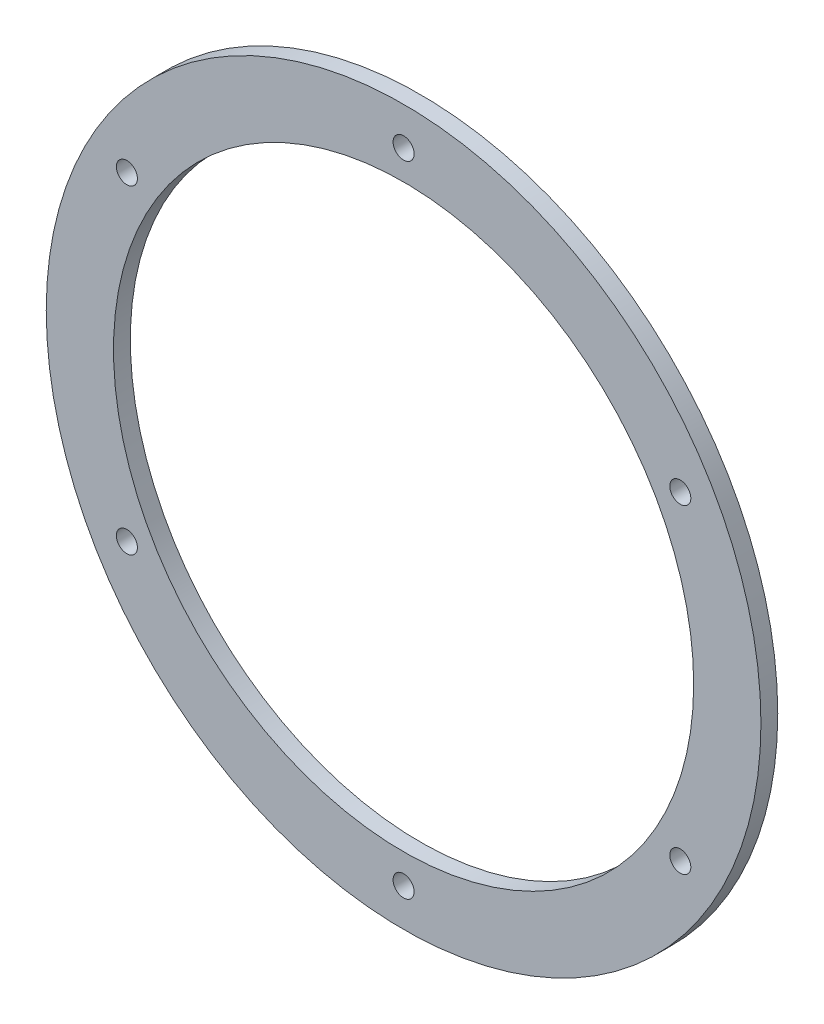
ISO-10303-21;
HEADER;
FILE_DESCRIPTION(('STEP AP214'),'2;1');
FILE_NAME('part.step','',(''),(''),'','','');
FILE_SCHEMA(('AUTOMOTIVE_DESIGN { 1 0 10303 214 1 1 1 1 }'));
ENDSEC;
DATA;
#1=APPLICATION_CONTEXT('core data for automotive mechanical design processes');
#2=APPLICATION_PROTOCOL_DEFINITION('international standard','automotive_design',2000,#1);
#3=PRODUCT_CONTEXT('',#1,'mechanical');
#4=PRODUCT('Part','Part','',(#3));
#5=PRODUCT_RELATED_PRODUCT_CATEGORY('part','',(#4));
#6=PRODUCT_DEFINITION_FORMATION('','',#4);
#7=PRODUCT_DEFINITION_CONTEXT('part definition',#1,'design');
#8=PRODUCT_DEFINITION('design','',#6,#7);
#9=PRODUCT_DEFINITION_SHAPE('','',#8);
#10=(LENGTH_UNIT() NAMED_UNIT(*) SI_UNIT(.MILLI.,.METRE.));
#11=(NAMED_UNIT(*) PLANE_ANGLE_UNIT() SI_UNIT($,.RADIAN.));
#12=(NAMED_UNIT(*) SI_UNIT($,.STERADIAN.) SOLID_ANGLE_UNIT());
#13=UNCERTAINTY_MEASURE_WITH_UNIT(LENGTH_MEASURE(1.E-05),#10,'distance_accuracy_value','');
#14=(GEOMETRIC_REPRESENTATION_CONTEXT(3) GLOBAL_UNCERTAINTY_ASSIGNED_CONTEXT((#13)) GLOBAL_UNIT_ASSIGNED_CONTEXT((#10,
#11,#12)) REPRESENTATION_CONTEXT('',''));
#15=CARTESIAN_POINT('',(0.,0.,0.));
#16=DIRECTION('',(0.,0.,1.));
#17=DIRECTION('',(1.,0.,0.));
#18=AXIS2_PLACEMENT_3D('',#15,#16,#17);
#19=CARTESIAN_POINT('',(0.,0.,2.));
#20=DIRECTION('',(0.,0.,1.));
#21=DIRECTION('',(1.,0.,0.));
#22=AXIS2_PLACEMENT_3D('',#19,#20,#21);
#23=PLANE('',#22);
#24=CARTESIAN_POINT('',(-32.9089653438084,19.0000000000004,2.));
#25=DIRECTION('',(0.,0.,1.));
#26=DIRECTION('',(0.50000000000001,0.866025403784433,0.));
#27=AXIS2_PLACEMENT_3D('',#24,#25,#26);
#28=CIRCLE('',#27,1.25);
#29=CARTESIAN_POINT('',(-32.2839653438084,20.0825317547309,2.));
#30=VERTEX_POINT('',#29);
#31=EDGE_CURVE('E63',#30,#30,#28,.T.);
#32=ORIENTED_EDGE('',*,*,#31,.F.);
#33=EDGE_LOOP('',(#32));
#34=FACE_BOUND('',#33,.T.);
#35=CARTESIAN_POINT('',(-32.9089653438088,-18.9999999999997,2.));
#36=DIRECTION('',(0.,0.,1.));
#37=DIRECTION('',(-0.499999999999992,0.866025403784443,0.));
#38=AXIS2_PLACEMENT_3D('',#35,#36,#37);
#39=CIRCLE('',#38,1.25);
#40=CARTESIAN_POINT('',(-33.5339653438088,-17.9174682452691,2.));
#41=VERTEX_POINT('',#40);
#42=EDGE_CURVE('E69',#41,#41,#39,.T.);
#43=ORIENTED_EDGE('',*,*,#42,.F.);
#44=EDGE_LOOP('',(#43));
#45=FACE_BOUND('',#44,.T.);
#46=CARTESIAN_POINT('',(0.,-38.,2.));
#47=DIRECTION('',(0.,0.,1.));
#48=DIRECTION('',(-1.,0.,0.));
#49=AXIS2_PLACEMENT_3D('',#46,#47,#48);
#50=CIRCLE('',#49,1.25);
#51=CARTESIAN_POINT('',(-1.25,-38.,2.));
#52=VERTEX_POINT('',#51);
#53=EDGE_CURVE('E75',#52,#52,#50,.T.);
#54=ORIENTED_EDGE('',*,*,#53,.F.);
#55=EDGE_LOOP('',(#54));
#56=FACE_BOUND('',#55,.T.);
#57=CARTESIAN_POINT('',(32.9089653438086,-19.0000000000002,2.));
#58=DIRECTION('',(0.,0.,1.));
#59=DIRECTION('',(-0.500000000000004,-0.866025403784436,0.));
#60=AXIS2_PLACEMENT_3D('',#57,#58,#59);
#61=CIRCLE('',#60,1.25);
#62=CARTESIAN_POINT('',(32.2839653438086,-20.0825317547307,2.));
#63=VERTEX_POINT('',#62);
#64=EDGE_CURVE('E81',#63,#63,#61,.T.);
#65=ORIENTED_EDGE('',*,*,#64,.F.);
#66=EDGE_LOOP('',(#65));
#67=FACE_BOUND('',#66,.T.);
#68=CARTESIAN_POINT('',(32.9089653438087,18.9999999999999,2.));
#69=DIRECTION('',(0.,0.,1.));
#70=DIRECTION('',(0.499999999999998,-0.86602540378444,0.));
#71=AXIS2_PLACEMENT_3D('',#68,#69,#70);
#72=CIRCLE('',#71,1.25);
#73=CARTESIAN_POINT('',(33.5339653438087,17.9174682452694,2.));
#74=VERTEX_POINT('',#73);
#75=EDGE_CURVE('E57',#74,#74,#72,.T.);
#76=ORIENTED_EDGE('',*,*,#75,.F.);
#77=EDGE_LOOP('',(#76));
#78=FACE_BOUND('',#77,.T.);
#79=CARTESIAN_POINT('',(0.,38.,2.));
#80=DIRECTION('',(0.,0.,1.));
#81=DIRECTION('',(1.,0.,0.));
#82=AXIS2_PLACEMENT_3D('',#79,#80,#81);
#83=CIRCLE('',#82,1.25);
#84=CARTESIAN_POINT('',(1.25,38.,2.));
#85=VERTEX_POINT('',#84);
#86=EDGE_CURVE('E51',#85,#85,#83,.T.);
#87=ORIENTED_EDGE('',*,*,#86,.F.);
#88=EDGE_LOOP('',(#87));
#89=FACE_BOUND('',#88,.T.);
#90=CARTESIAN_POINT('',(0.,0.,2.));
#91=DIRECTION('',(0.,0.,1.));
#92=DIRECTION('',(1.,0.,0.));
#93=AXIS2_PLACEMENT_3D('',#90,#91,#92);
#94=CIRCLE('',#93,42.5);
#95=CARTESIAN_POINT('',(42.5,0.,2.));
#96=VERTEX_POINT('',#95);
#97=EDGE_CURVE('E10',#96,#96,#94,.T.);
#98=ORIENTED_EDGE('',*,*,#97,.T.);
#99=EDGE_LOOP('',(#98));
#100=FACE_BOUND('',#99,.T.);
#101=CARTESIAN_POINT('',(0.,0.,2.));
#102=DIRECTION('',(0.,0.,1.));
#103=DIRECTION('',(1.,0.,0.));
#104=AXIS2_PLACEMENT_3D('',#101,#102,#103);
#105=CIRCLE('',#104,34.5);
#106=CARTESIAN_POINT('',(34.5,0.,2.));
#107=VERTEX_POINT('',#106);
#108=EDGE_CURVE('E43',#107,#107,#105,.T.);
#109=ORIENTED_EDGE('',*,*,#108,.F.);
#110=EDGE_LOOP('',(#109));
#111=FACE_BOUND('',#110,.T.);
#112=ADVANCED_FACE('F32',(#34,#45,#56,#67,#78,#89,#100,#111),#23,.T.);
#113=CARTESIAN_POINT('',(0.,0.,0.));
#114=DIRECTION('',(0.,0.,1.));
#115=DIRECTION('',(1.,0.,0.));
#116=AXIS2_PLACEMENT_3D('',#113,#114,#115);
#117=PLANE('',#116);
#118=CARTESIAN_POINT('',(-32.9089653438084,19.0000000000004,0.));
#119=DIRECTION('',(0.,0.,1.));
#120=DIRECTION('',(0.50000000000001,0.866025403784433,0.));
#121=AXIS2_PLACEMENT_3D('',#118,#119,#120);
#122=CIRCLE('',#121,1.25);
#123=CARTESIAN_POINT('',(-32.2839653438084,20.0825317547309,0.));
#124=VERTEX_POINT('',#123);
#125=EDGE_CURVE('E66',#124,#124,#122,.T.);
#126=ORIENTED_EDGE('',*,*,#125,.T.);
#127=EDGE_LOOP('',(#126));
#128=FACE_BOUND('',#127,.T.);
#129=CARTESIAN_POINT('',(-32.9089653438088,-18.9999999999997,0.));
#130=DIRECTION('',(0.,0.,1.));
#131=DIRECTION('',(-0.499999999999992,0.866025403784443,0.));
#132=AXIS2_PLACEMENT_3D('',#129,#130,#131);
#133=CIRCLE('',#132,1.25);
#134=CARTESIAN_POINT('',(-33.5339653438088,-17.9174682452691,0.));
#135=VERTEX_POINT('',#134);
#136=EDGE_CURVE('E72',#135,#135,#133,.T.);
#137=ORIENTED_EDGE('',*,*,#136,.T.);
#138=EDGE_LOOP('',(#137));
#139=FACE_BOUND('',#138,.T.);
#140=CARTESIAN_POINT('',(0.,-38.,0.));
#141=DIRECTION('',(0.,0.,1.));
#142=DIRECTION('',(-1.,0.,0.));
#143=AXIS2_PLACEMENT_3D('',#140,#141,#142);
#144=CIRCLE('',#143,1.25);
#145=CARTESIAN_POINT('',(-1.25,-38.,0.));
#146=VERTEX_POINT('',#145);
#147=EDGE_CURVE('E78',#146,#146,#144,.T.);
#148=ORIENTED_EDGE('',*,*,#147,.T.);
#149=EDGE_LOOP('',(#148));
#150=FACE_BOUND('',#149,.T.);
#151=CARTESIAN_POINT('',(32.9089653438086,-19.0000000000002,0.));
#152=DIRECTION('',(0.,0.,1.));
#153=DIRECTION('',(-0.500000000000004,-0.866025403784436,0.));
#154=AXIS2_PLACEMENT_3D('',#151,#152,#153);
#155=CIRCLE('',#154,1.25);
#156=CARTESIAN_POINT('',(32.2839653438086,-20.0825317547307,0.));
#157=VERTEX_POINT('',#156);
#158=EDGE_CURVE('E60',#157,#157,#155,.T.);
#159=ORIENTED_EDGE('',*,*,#158,.T.);
#160=EDGE_LOOP('',(#159));
#161=FACE_BOUND('',#160,.T.);
#162=CARTESIAN_POINT('',(32.9089653438087,18.9999999999999,0.));
#163=DIRECTION('',(0.,0.,1.));
#164=DIRECTION('',(0.499999999999998,-0.86602540378444,0.));
#165=AXIS2_PLACEMENT_3D('',#162,#163,#164);
#166=CIRCLE('',#165,1.25);
#167=CARTESIAN_POINT('',(33.5339653438087,17.9174682452694,0.));
#168=VERTEX_POINT('',#167);
#169=EDGE_CURVE('E54',#168,#168,#166,.T.);
#170=ORIENTED_EDGE('',*,*,#169,.T.);
#171=EDGE_LOOP('',(#170));
#172=FACE_BOUND('',#171,.T.);
#173=CARTESIAN_POINT('',(0.,38.,0.));
#174=DIRECTION('',(0.,0.,1.));
#175=DIRECTION('',(1.,0.,0.));
#176=AXIS2_PLACEMENT_3D('',#173,#174,#175);
#177=CIRCLE('',#176,1.25);
#178=CARTESIAN_POINT('',(1.25,38.,0.));
#179=VERTEX_POINT('',#178);
#180=EDGE_CURVE('E48',#179,#179,#177,.T.);
#181=ORIENTED_EDGE('',*,*,#180,.T.);
#182=EDGE_LOOP('',(#181));
#183=FACE_BOUND('',#182,.T.);
#184=CARTESIAN_POINT('',(0.,0.,0.));
#185=DIRECTION('',(0.,0.,1.));
#186=DIRECTION('',(1.,0.,0.));
#187=AXIS2_PLACEMENT_3D('',#184,#185,#186);
#188=CIRCLE('',#187,42.5);
#189=CARTESIAN_POINT('',(42.5,0.,0.));
#190=VERTEX_POINT('',#189);
#191=EDGE_CURVE('E36',#190,#190,#188,.T.);
#192=ORIENTED_EDGE('',*,*,#191,.F.);
#193=EDGE_LOOP('',(#192));
#194=FACE_BOUND('',#193,.T.);
#195=CARTESIAN_POINT('',(0.,0.,0.));
#196=DIRECTION('',(0.,0.,1.));
#197=DIRECTION('',(1.,0.,0.));
#198=AXIS2_PLACEMENT_3D('',#195,#196,#197);
#199=CIRCLE('',#198,34.5);
#200=CARTESIAN_POINT('',(34.5,0.,0.));
#201=VERTEX_POINT('',#200);
#202=EDGE_CURVE('E45',#201,#201,#199,.T.);
#203=ORIENTED_EDGE('',*,*,#202,.T.);
#204=EDGE_LOOP('',(#203));
#205=FACE_BOUND('',#204,.T.);
#206=ADVANCED_FACE('F87',(#128,#139,#150,#161,#172,#183,#194,#205),#117,.F.);
#207=CARTESIAN_POINT('',(0.,0.,2.));
#208=DIRECTION('',(0.,0.,-1.));
#209=DIRECTION('',(-1.,0.,0.));
#210=AXIS2_PLACEMENT_3D('',#207,#208,#209);
#211=CYLINDRICAL_SURFACE('',#210,42.5);
#212=ORIENTED_EDGE('',*,*,#97,.F.);
#213=EDGE_LOOP('',(#212));
#214=FACE_BOUND('',#213,.T.);
#215=ORIENTED_EDGE('',*,*,#191,.T.);
#216=EDGE_LOOP('',(#215));
#217=FACE_BOUND('',#216,.T.);
#218=ADVANCED_FACE('F34',(#214,#217),#211,.T.);
#219=CARTESIAN_POINT('',(0.,0.,2.));
#220=DIRECTION('',(0.,0.,-1.));
#221=DIRECTION('',(-1.,0.,0.));
#222=AXIS2_PLACEMENT_3D('',#219,#220,#221);
#223=CYLINDRICAL_SURFACE('',#222,34.5);
#224=ORIENTED_EDGE('',*,*,#108,.T.);
#225=EDGE_LOOP('',(#224));
#226=FACE_BOUND('',#225,.T.);
#227=ORIENTED_EDGE('',*,*,#202,.F.);
#228=EDGE_LOOP('',(#227));
#229=FACE_BOUND('',#228,.T.);
#230=ADVANCED_FACE('F108',(#226,#229),#223,.F.);
#231=CARTESIAN_POINT('',(0.,38.,0.));
#232=DIRECTION('',(0.,0.,1.));
#233=DIRECTION('',(1.,0.,0.));
#234=AXIS2_PLACEMENT_3D('',#231,#232,#233);
#235=CYLINDRICAL_SURFACE('',#234,1.25);
#236=ORIENTED_EDGE('',*,*,#180,.F.);
#237=EDGE_LOOP('',(#236));
#238=FACE_BOUND('',#237,.T.);
#239=ORIENTED_EDGE('',*,*,#86,.T.);
#240=EDGE_LOOP('',(#239));
#241=FACE_BOUND('',#240,.T.);
#242=ADVANCED_FACE('F111',(#238,#241),#235,.F.);
#243=CARTESIAN_POINT('',(32.9089653438087,18.9999999999999,0.));
#244=DIRECTION('',(0.,0.,1.));
#245=DIRECTION('',(1.,0.,0.));
#246=AXIS2_PLACEMENT_3D('',#243,#244,#245);
#247=CYLINDRICAL_SURFACE('',#246,1.25);
#248=ORIENTED_EDGE('',*,*,#169,.F.);
#249=EDGE_LOOP('',(#248));
#250=FACE_BOUND('',#249,.T.);
#251=ORIENTED_EDGE('',*,*,#75,.T.);
#252=EDGE_LOOP('',(#251));
#253=FACE_BOUND('',#252,.T.);
#254=ADVANCED_FACE('F94',(#250,#253),#247,.F.);
#255=CARTESIAN_POINT('',(32.9089653438086,-19.0000000000002,0.));
#256=DIRECTION('',(0.,0.,1.));
#257=DIRECTION('',(1.,0.,0.));
#258=AXIS2_PLACEMENT_3D('',#255,#256,#257);
#259=CYLINDRICAL_SURFACE('',#258,1.25);
#260=ORIENTED_EDGE('',*,*,#158,.F.);
#261=EDGE_LOOP('',(#260));
#262=FACE_BOUND('',#261,.T.);
#263=ORIENTED_EDGE('',*,*,#64,.T.);
#264=EDGE_LOOP('',(#263));
#265=FACE_BOUND('',#264,.T.);
#266=ADVANCED_FACE('F90',(#262,#265),#259,.F.);
#267=CARTESIAN_POINT('',(0.,-38.,0.));
#268=DIRECTION('',(0.,0.,1.));
#269=DIRECTION('',(1.,0.,0.));
#270=AXIS2_PLACEMENT_3D('',#267,#268,#269);
#271=CYLINDRICAL_SURFACE('',#270,1.25);
#272=ORIENTED_EDGE('',*,*,#147,.F.);
#273=EDGE_LOOP('',(#272));
#274=FACE_BOUND('',#273,.T.);
#275=ORIENTED_EDGE('',*,*,#53,.T.);
#276=EDGE_LOOP('',(#275));
#277=FACE_BOUND('',#276,.T.);
#278=ADVANCED_FACE('F93',(#274,#277),#271,.F.);
#279=CARTESIAN_POINT('',(-32.9089653438088,-18.9999999999997,0.));
#280=DIRECTION('',(0.,0.,1.));
#281=DIRECTION('',(1.,0.,0.));
#282=AXIS2_PLACEMENT_3D('',#279,#280,#281);
#283=CYLINDRICAL_SURFACE('',#282,1.25);
#284=ORIENTED_EDGE('',*,*,#136,.F.);
#285=EDGE_LOOP('',(#284));
#286=FACE_BOUND('',#285,.T.);
#287=ORIENTED_EDGE('',*,*,#42,.T.);
#288=EDGE_LOOP('',(#287));
#289=FACE_BOUND('',#288,.T.);
#290=ADVANCED_FACE('F132',(#286,#289),#283,.F.);
#291=CARTESIAN_POINT('',(-32.9089653438084,19.0000000000004,0.));
#292=DIRECTION('',(0.,0.,1.));
#293=DIRECTION('',(1.,0.,0.));
#294=AXIS2_PLACEMENT_3D('',#291,#292,#293);
#295=CYLINDRICAL_SURFACE('',#294,1.25);
#296=ORIENTED_EDGE('',*,*,#125,.F.);
#297=EDGE_LOOP('',(#296));
#298=FACE_BOUND('',#297,.T.);
#299=ORIENTED_EDGE('',*,*,#31,.T.);
#300=EDGE_LOOP('',(#299));
#301=FACE_BOUND('',#300,.T.);
#302=ADVANCED_FACE('F129',(#298,#301),#295,.F.);
#303=CLOSED_SHELL('',(#112,#206,#218,#230,#242,#254,#266,#278,#290,#302));
#304=MANIFOLD_SOLID_BREP('B2',#303);
#305=ADVANCED_BREP_SHAPE_REPRESENTATION('',(#18,#304),#14);
#306=SHAPE_DEFINITION_REPRESENTATION(#9,#305);
ENDSEC;
END-ISO-10303-21;
